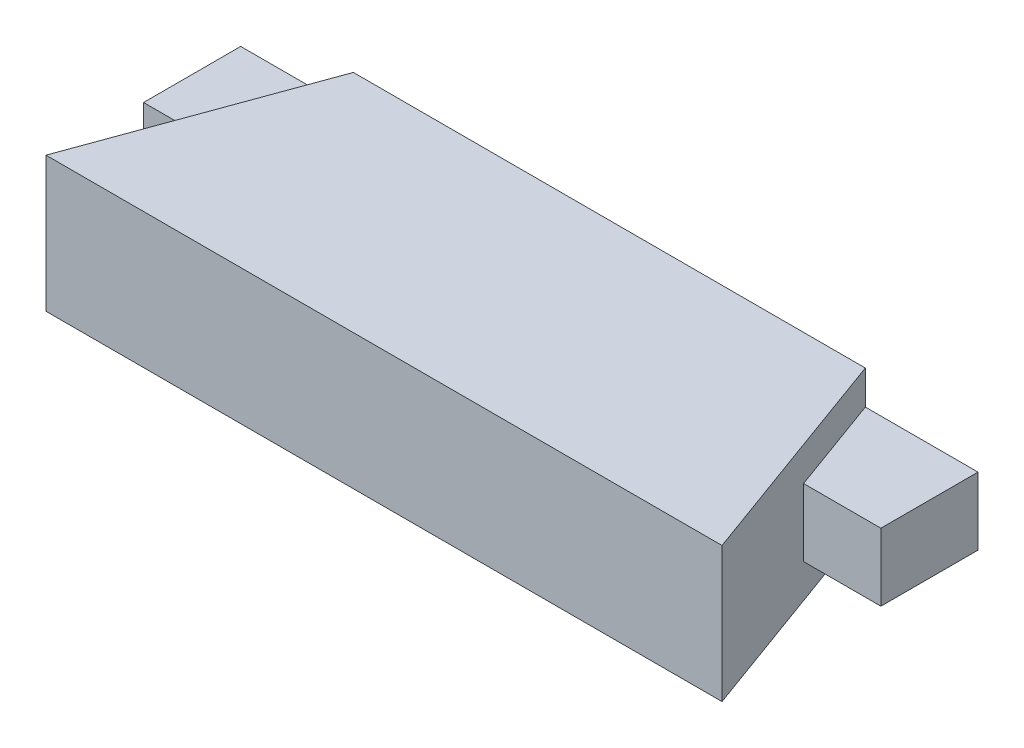
ISO-10303-21;
HEADER;
FILE_DESCRIPTION(('STEP AP214'),'2;1');
FILE_NAME('part.step','',(''),(''),'','','');
FILE_SCHEMA(('AUTOMOTIVE_DESIGN { 1 0 10303 214 1 1 1 1 }'));
ENDSEC;
DATA;
#1=APPLICATION_CONTEXT('core data for automotive mechanical design processes');
#2=APPLICATION_PROTOCOL_DEFINITION('international standard','automotive_design',2000,#1);
#3=PRODUCT_CONTEXT('',#1,'mechanical');
#4=PRODUCT('Part','Part','',(#3));
#5=PRODUCT_RELATED_PRODUCT_CATEGORY('part','',(#4));
#6=PRODUCT_DEFINITION_FORMATION('','',#4);
#7=PRODUCT_DEFINITION_CONTEXT('part definition',#1,'design');
#8=PRODUCT_DEFINITION('design','',#6,#7);
#9=PRODUCT_DEFINITION_SHAPE('','',#8);
#10=(LENGTH_UNIT() NAMED_UNIT(*) SI_UNIT(.MILLI.,.METRE.));
#11=(NAMED_UNIT(*) PLANE_ANGLE_UNIT() SI_UNIT($,.RADIAN.));
#12=(NAMED_UNIT(*) SI_UNIT($,.STERADIAN.) SOLID_ANGLE_UNIT());
#13=UNCERTAINTY_MEASURE_WITH_UNIT(LENGTH_MEASURE(1.E-05),#10,'distance_accuracy_value','');
#14=(GEOMETRIC_REPRESENTATION_CONTEXT(3) GLOBAL_UNCERTAINTY_ASSIGNED_CONTEXT((#13)) GLOBAL_UNIT_ASSIGNED_CONTEXT((#10,
#11,#12)) REPRESENTATION_CONTEXT('',''));
#15=CARTESIAN_POINT('',(0.,0.,0.));
#16=DIRECTION('',(0.,0.,1.));
#17=DIRECTION('',(1.,0.,0.));
#18=AXIS2_PLACEMENT_3D('',#15,#16,#17);
#19=CARTESIAN_POINT('',(-75.,30.,0.));
#20=DIRECTION('',(0.93969262078591,0.,0.342020143325666));
#21=DIRECTION('',(0.342020143325666,0.,-0.93969262078591));
#22=AXIS2_PLACEMENT_3D('',#19,#20,#21);
#23=PLANE('',#22);
#24=DIRECTION('',(0.,-1.,0.));
#25=VECTOR('',#24,1.);
#26=CARTESIAN_POINT('',(-56.8014882866901,30.,-50.));
#27=LINE('',#26,#25);
#28=CARTESIAN_POINT('',(-56.8014882866901,30.,-50.));
#29=VERTEX_POINT('',#28);
#30=CARTESIAN_POINT('',(-56.8014882866901,22.5,-50.));
#31=VERTEX_POINT('',#30);
#32=EDGE_CURVE('E199',#29,#31,#27,.T.);
#33=ORIENTED_EDGE('',*,*,#32,.T.);
#34=DIRECTION('',(-0.342020143325666,0.,0.93969262078591));
#35=VECTOR('',#34,1.);
#36=CARTESIAN_POINT('',(-75.,22.5,0.));
#37=LINE('',#36,#35);
#38=CARTESIAN_POINT('',(-64.6450468351266,22.5,-28.45));
#39=VERTEX_POINT('',#38);
#40=EDGE_CURVE('E47',#31,#39,#37,.T.);
#41=ORIENTED_EDGE('',*,*,#40,.T.);
#42=DIRECTION('',(0.,1.,0.));
#43=VECTOR('',#42,1.);
#44=CARTESIAN_POINT('',(-64.6450468351266,30.,-28.45));
#45=LINE('',#44,#43);
#46=CARTESIAN_POINT('',(-64.6450468351266,7.49999999999997,-28.45));
#47=VERTEX_POINT('',#46);
#48=EDGE_CURVE('E51',#47,#39,#45,.T.);
#49=ORIENTED_EDGE('',*,*,#48,.F.);
#50=DIRECTION('',(0.342020143325666,0.,-0.93969262078591));
#51=VECTOR('',#50,1.);
#52=CARTESIAN_POINT('',(-75.,7.49999999999997,0.));
#53=LINE('',#52,#51);
#54=CARTESIAN_POINT('',(-56.8014882866901,7.49999999999997,-50.));
#55=VERTEX_POINT('',#54);
#56=EDGE_CURVE('E171',#47,#55,#53,.T.);
#57=ORIENTED_EDGE('',*,*,#56,.T.);
#58=CARTESIAN_POINT('',(-56.8014882866901,0.,-50.));
#59=VERTEX_POINT('',#58);
#60=EDGE_CURVE('E189',#55,#59,#27,.T.);
#61=ORIENTED_EDGE('',*,*,#60,.T.);
#62=DIRECTION('',(-0.342020143325666,0.,0.939692620785909));
#63=VECTOR('',#62,1.);
#64=CARTESIAN_POINT('',(-75.,0.,0.));
#65=LINE('',#64,#63);
#66=CARTESIAN_POINT('',(-75.,0.,0.));
#67=VERTEX_POINT('',#66);
#68=EDGE_CURVE('E178',#59,#67,#65,.T.);
#69=ORIENTED_EDGE('',*,*,#68,.T.);
#70=DIRECTION('',(0.,-1.,0.));
#71=VECTOR('',#70,1.);
#72=CARTESIAN_POINT('',(-75.,30.,0.));
#73=LINE('',#72,#71);
#74=CARTESIAN_POINT('',(-75.,30.,0.));
#75=VERTEX_POINT('',#74);
#76=EDGE_CURVE('E40',#75,#67,#73,.T.);
#77=ORIENTED_EDGE('',*,*,#76,.F.);
#78=DIRECTION('',(-0.342020143325666,0.,0.939692620785909));
#79=VECTOR('',#78,1.);
#80=CARTESIAN_POINT('',(-75.,30.,0.));
#81=LINE('',#80,#79);
#82=EDGE_CURVE('E179',#29,#75,#81,.T.);
#83=ORIENTED_EDGE('',*,*,#82,.F.);
#84=EDGE_LOOP('',(#33,#41,#49,#57,#61,#69,#77,#83));
#85=FACE_BOUND('',#84,.T.);
#86=ADVANCED_FACE('F33',(#85),#23,.F.);
#87=CARTESIAN_POINT('',(-75.,30.,0.));
#88=DIRECTION('',(0.,0.,-1.));
#89=DIRECTION('',(-1.,0.,0.));
#90=AXIS2_PLACEMENT_3D('',#87,#88,#89);
#91=PLANE('',#90);
#92=DIRECTION('',(1.,0.,0.));
#93=VECTOR('',#92,1.);
#94=CARTESIAN_POINT('',(-75.,0.,0.));
#95=LINE('',#94,#93);
#96=CARTESIAN_POINT('',(75.,0.,0.));
#97=VERTEX_POINT('',#96);
#98=EDGE_CURVE('E192',#67,#97,#95,.T.);
#99=ORIENTED_EDGE('',*,*,#98,.T.);
#100=DIRECTION('',(0.,-1.,0.));
#101=VECTOR('',#100,1.);
#102=CARTESIAN_POINT('',(75.,30.,0.));
#103=LINE('',#102,#101);
#104=CARTESIAN_POINT('',(75.,30.,0.));
#105=VERTEX_POINT('',#104);
#106=EDGE_CURVE('E205',#105,#97,#103,.T.);
#107=ORIENTED_EDGE('',*,*,#106,.F.);
#108=DIRECTION('',(1.,0.,0.));
#109=VECTOR('',#108,1.);
#110=CARTESIAN_POINT('',(-75.,30.,0.));
#111=LINE('',#110,#109);
#112=EDGE_CURVE('E182',#75,#105,#111,.T.);
#113=ORIENTED_EDGE('',*,*,#112,.F.);
#114=ORIENTED_EDGE('',*,*,#76,.T.);
#115=EDGE_LOOP('',(#99,#107,#113,#114));
#116=FACE_BOUND('',#115,.T.);
#117=ADVANCED_FACE('F210',(#116),#91,.F.);
#118=CARTESIAN_POINT('',(75.,30.,0.));
#119=DIRECTION('',(-0.939692620785907,0.,0.342020143325673));
#120=DIRECTION('',(0.342020143325673,0.,0.939692620785907));
#121=AXIS2_PLACEMENT_3D('',#118,#119,#120);
#122=PLANE('',#121);
#123=DIRECTION('',(0.,-1.,0.));
#124=VECTOR('',#123,1.);
#125=CARTESIAN_POINT('',(64.6450468351264,30.,-28.45));
#126=LINE('',#125,#124);
#127=CARTESIAN_POINT('',(64.6450468351264,22.5,-28.45));
#128=VERTEX_POINT('',#127);
#129=CARTESIAN_POINT('',(64.6450468351264,7.5,-28.45));
#130=VERTEX_POINT('',#129);
#131=EDGE_CURVE('E11',#128,#130,#126,.T.);
#132=ORIENTED_EDGE('',*,*,#131,.F.);
#133=DIRECTION('',(-0.342020143325673,0.,-0.939692620785907));
#134=VECTOR('',#133,1.);
#135=CARTESIAN_POINT('',(75.,22.5,0.));
#136=LINE('',#135,#134);
#137=CARTESIAN_POINT('',(56.8014882866896,22.5,-50.));
#138=VERTEX_POINT('',#137);
#139=EDGE_CURVE('E173',#128,#138,#136,.T.);
#140=ORIENTED_EDGE('',*,*,#139,.T.);
#141=DIRECTION('',(0.,-1.,0.));
#142=VECTOR('',#141,1.);
#143=CARTESIAN_POINT('',(56.8014882866896,30.,-50.));
#144=LINE('',#143,#142);
#145=CARTESIAN_POINT('',(56.8014882866896,30.,-50.));
#146=VERTEX_POINT('',#145);
#147=EDGE_CURVE('E202',#146,#138,#144,.T.);
#148=ORIENTED_EDGE('',*,*,#147,.F.);
#149=DIRECTION('',(-0.342020143325673,0.,-0.939692620785907));
#150=VECTOR('',#149,1.);
#151=CARTESIAN_POINT('',(75.,30.,0.));
#152=LINE('',#151,#150);
#153=EDGE_CURVE('E185',#105,#146,#152,.T.);
#154=ORIENTED_EDGE('',*,*,#153,.F.);
#155=ORIENTED_EDGE('',*,*,#106,.T.);
#156=DIRECTION('',(-0.342020143325673,0.,-0.939692620785907));
#157=VECTOR('',#156,1.);
#158=CARTESIAN_POINT('',(75.,0.,0.));
#159=LINE('',#158,#157);
#160=CARTESIAN_POINT('',(56.8014882866896,0.,-50.));
#161=VERTEX_POINT('',#160);
#162=EDGE_CURVE('E194',#97,#161,#159,.T.);
#163=ORIENTED_EDGE('',*,*,#162,.T.);
#164=CARTESIAN_POINT('',(56.8014882866896,7.49999999999998,-50.));
#165=VERTEX_POINT('',#164);
#166=EDGE_CURVE('E201',#165,#161,#144,.T.);
#167=ORIENTED_EDGE('',*,*,#166,.F.);
#168=DIRECTION('',(0.342020143325673,0.,0.939692620785907));
#169=VECTOR('',#168,1.);
#170=CARTESIAN_POINT('',(75.,7.5,0.));
#171=LINE('',#170,#169);
#172=EDGE_CURVE('E165',#165,#130,#171,.T.);
#173=ORIENTED_EDGE('',*,*,#172,.T.);
#174=EDGE_LOOP('',(#132,#140,#148,#154,#155,#163,#167,#173));
#175=FACE_BOUND('',#174,.T.);
#176=ADVANCED_FACE('F220',(#175),#122,.F.);
#177=CARTESIAN_POINT('',(-56.8014882866901,30.,-50.));
#178=DIRECTION('',(0.,0.,1.));
#179=DIRECTION('',(1.,0.,0.));
#180=AXIS2_PLACEMENT_3D('',#177,#178,#179);
#181=PLANE('',#180);
#182=ORIENTED_EDGE('',*,*,#60,.F.);
#183=DIRECTION('',(-1.,0.,0.));
#184=VECTOR('',#183,1.);
#185=CARTESIAN_POINT('',(81.8,7.5,-50.));
#186=LINE('',#185,#184);
#187=CARTESIAN_POINT('',(-81.8,7.49999999999997,-50.));
#188=VERTEX_POINT('',#187);
#189=EDGE_CURVE('E159',#55,#188,#186,.T.);
#190=ORIENTED_EDGE('',*,*,#189,.T.);
#191=DIRECTION('',(0.,1.,0.));
#192=VECTOR('',#191,1.);
#193=CARTESIAN_POINT('',(-81.8,22.5,-50.));
#194=LINE('',#193,#192);
#195=CARTESIAN_POINT('',(-81.8,22.5,-50.));
#196=VERTEX_POINT('',#195);
#197=EDGE_CURVE('E161',#188,#196,#194,.T.);
#198=ORIENTED_EDGE('',*,*,#197,.T.);
#199=DIRECTION('',(1.,0.,0.));
#200=VECTOR('',#199,1.);
#201=CARTESIAN_POINT('',(81.8,22.5,-50.));
#202=LINE('',#201,#200);
#203=EDGE_CURVE('E146',#196,#31,#202,.T.);
#204=ORIENTED_EDGE('',*,*,#203,.T.);
#205=ORIENTED_EDGE('',*,*,#32,.F.);
#206=DIRECTION('',(-1.,0.,0.));
#207=VECTOR('',#206,1.);
#208=CARTESIAN_POINT('',(-56.8014882866901,30.,-50.));
#209=LINE('',#208,#207);
#210=EDGE_CURVE('E187',#146,#29,#209,.T.);
#211=ORIENTED_EDGE('',*,*,#210,.F.);
#212=ORIENTED_EDGE('',*,*,#147,.T.);
#213=CARTESIAN_POINT('',(81.8,22.5,-50.));
#214=VERTEX_POINT('',#213);
#215=EDGE_CURVE('E149',#138,#214,#202,.T.);
#216=ORIENTED_EDGE('',*,*,#215,.T.);
#217=DIRECTION('',(0.,-1.,0.));
#218=VECTOR('',#217,1.);
#219=CARTESIAN_POINT('',(81.8,22.5,-50.));
#220=LINE('',#219,#218);
#221=CARTESIAN_POINT('',(81.8,7.5,-50.));
#222=VERTEX_POINT('',#221);
#223=EDGE_CURVE('E157',#214,#222,#220,.T.);
#224=ORIENTED_EDGE('',*,*,#223,.T.);
#225=EDGE_CURVE('E125',#222,#165,#186,.T.);
#226=ORIENTED_EDGE('',*,*,#225,.T.);
#227=ORIENTED_EDGE('',*,*,#166,.T.);
#228=DIRECTION('',(-1.,0.,0.));
#229=VECTOR('',#228,1.);
#230=CARTESIAN_POINT('',(-56.8014882866901,0.,-50.));
#231=LINE('',#230,#229);
#232=EDGE_CURVE('E183',#161,#59,#231,.T.);
#233=ORIENTED_EDGE('',*,*,#232,.T.);
#234=EDGE_LOOP('',(#182,#190,#198,#204,#205,#211,#212,#216,#224,#226,#227,#233));
#235=FACE_BOUND('',#234,.T.);
#236=ADVANCED_FACE('F232',(#235),#181,.F.);
#237=CARTESIAN_POINT('',(0.,30.,0.));
#238=DIRECTION('',(0.,-1.,0.));
#239=DIRECTION('',(0.,0.,-1.));
#240=AXIS2_PLACEMENT_3D('',#237,#238,#239);
#241=PLANE('',#240);
#242=ORIENTED_EDGE('',*,*,#82,.T.);
#243=ORIENTED_EDGE('',*,*,#112,.T.);
#244=ORIENTED_EDGE('',*,*,#153,.T.);
#245=ORIENTED_EDGE('',*,*,#210,.T.);
#246=EDGE_LOOP('',(#242,#243,#244,#245));
#247=FACE_BOUND('',#246,.T.);
#248=ADVANCED_FACE('F225',(#247),#241,.F.);
#249=CARTESIAN_POINT('',(0.,0.,0.));
#250=DIRECTION('',(0.,-1.,0.));
#251=DIRECTION('',(0.,0.,-1.));
#252=AXIS2_PLACEMENT_3D('',#249,#250,#251);
#253=PLANE('',#252);
#254=ORIENTED_EDGE('',*,*,#68,.F.);
#255=ORIENTED_EDGE('',*,*,#232,.F.);
#256=ORIENTED_EDGE('',*,*,#162,.F.);
#257=ORIENTED_EDGE('',*,*,#98,.F.);
#258=EDGE_LOOP('',(#254,#255,#256,#257));
#259=FACE_BOUND('',#258,.T.);
#260=ADVANCED_FACE('F216',(#259),#253,.T.);
#261=CARTESIAN_POINT('',(81.8,22.5,-28.45));
#262=DIRECTION('',(1.,0.,0.));
#263=DIRECTION('',(0.,0.,-1.));
#264=AXIS2_PLACEMENT_3D('',#261,#262,#263);
#265=PLANE('',#264);
#266=ORIENTED_EDGE('',*,*,#223,.F.);
#267=DIRECTION('',(0.,0.,-1.));
#268=VECTOR('',#267,1.);
#269=CARTESIAN_POINT('',(81.8,22.5,-28.45));
#270=LINE('',#269,#268);
#271=CARTESIAN_POINT('',(81.8,22.5,-28.45));
#272=VERTEX_POINT('',#271);
#273=EDGE_CURVE('E145',#272,#214,#270,.T.);
#274=ORIENTED_EDGE('',*,*,#273,.F.);
#275=DIRECTION('',(0.,-1.,0.));
#276=VECTOR('',#275,1.);
#277=CARTESIAN_POINT('',(81.8,22.5,-28.45));
#278=LINE('',#277,#276);
#279=CARTESIAN_POINT('',(81.8,7.5,-28.45));
#280=VERTEX_POINT('',#279);
#281=EDGE_CURVE('E137',#272,#280,#278,.T.);
#282=ORIENTED_EDGE('',*,*,#281,.T.);
#283=DIRECTION('',(0.,0.,-1.));
#284=VECTOR('',#283,1.);
#285=CARTESIAN_POINT('',(81.8,7.5,-28.45));
#286=LINE('',#285,#284);
#287=EDGE_CURVE('E119',#280,#222,#286,.T.);
#288=ORIENTED_EDGE('',*,*,#287,.T.);
#289=EDGE_LOOP('',(#266,#274,#282,#288));
#290=FACE_BOUND('',#289,.T.);
#291=ADVANCED_FACE('F143',(#290),#265,.T.);
#292=CARTESIAN_POINT('',(0.,0.,-28.45));
#293=DIRECTION('',(0.,0.,-1.));
#294=DIRECTION('',(-1.,0.,0.));
#295=AXIS2_PLACEMENT_3D('',#292,#293,#294);
#296=PLANE('',#295);
#297=DIRECTION('',(1.,0.,0.));
#298=VECTOR('',#297,1.);
#299=CARTESIAN_POINT('',(81.8,22.5,-28.45));
#300=LINE('',#299,#298);
#301=EDGE_CURVE('E154',#128,#272,#300,.T.);
#302=ORIENTED_EDGE('',*,*,#301,.F.);
#303=ORIENTED_EDGE('',*,*,#131,.T.);
#304=DIRECTION('',(-1.,0.,0.));
#305=VECTOR('',#304,1.);
#306=CARTESIAN_POINT('',(81.8,7.5,-28.45));
#307=LINE('',#306,#305);
#308=EDGE_CURVE('E123',#280,#130,#307,.T.);
#309=ORIENTED_EDGE('',*,*,#308,.F.);
#310=ORIENTED_EDGE('',*,*,#281,.F.);
#311=EDGE_LOOP('',(#302,#303,#309,#310));
#312=FACE_BOUND('',#311,.T.);
#313=ADVANCED_FACE('F136',(#312),#296,.F.);
#314=CARTESIAN_POINT('',(81.8,7.5,-28.45));
#315=DIRECTION('',(0.,-1.,0.));
#316=DIRECTION('',(1.,0.,0.));
#317=AXIS2_PLACEMENT_3D('',#314,#315,#316);
#318=PLANE('',#317);
#319=ORIENTED_EDGE('',*,*,#172,.F.);
#320=ORIENTED_EDGE('',*,*,#225,.F.);
#321=ORIENTED_EDGE('',*,*,#287,.F.);
#322=ORIENTED_EDGE('',*,*,#308,.T.);
#323=EDGE_LOOP('',(#319,#320,#321,#322));
#324=FACE_BOUND('',#323,.T.);
#325=ADVANCED_FACE('F122',(#324),#318,.T.);
#326=CARTESIAN_POINT('',(81.8,22.5,-28.45));
#327=DIRECTION('',(0.,1.,0.));
#328=DIRECTION('',(-1.,0.,0.));
#329=AXIS2_PLACEMENT_3D('',#326,#327,#328);
#330=PLANE('',#329);
#331=ORIENTED_EDGE('',*,*,#139,.F.);
#332=ORIENTED_EDGE('',*,*,#301,.T.);
#333=ORIENTED_EDGE('',*,*,#273,.T.);
#334=ORIENTED_EDGE('',*,*,#215,.F.);
#335=EDGE_LOOP('',(#331,#332,#333,#334));
#336=FACE_BOUND('',#335,.T.);
#337=ADVANCED_FACE('F252',(#336),#330,.T.);
#338=CARTESIAN_POINT('',(-81.8,7.49999999999997,-28.45));
#339=VERTEX_POINT('',#338);
#340=EDGE_CURVE('E140',#47,#339,#307,.T.);
#341=ORIENTED_EDGE('',*,*,#340,.F.);
#342=ORIENTED_EDGE('',*,*,#48,.T.);
#343=CARTESIAN_POINT('',(-81.8,22.5,-28.45));
#344=VERTEX_POINT('',#343);
#345=EDGE_CURVE('E131',#344,#39,#300,.T.);
#346=ORIENTED_EDGE('',*,*,#345,.F.);
#347=DIRECTION('',(0.,1.,0.));
#348=VECTOR('',#347,1.);
#349=CARTESIAN_POINT('',(-81.8,22.5,-28.45));
#350=LINE('',#349,#348);
#351=EDGE_CURVE('E139',#339,#344,#350,.T.);
#352=ORIENTED_EDGE('',*,*,#351,.F.);
#353=EDGE_LOOP('',(#341,#342,#346,#352));
#354=FACE_BOUND('',#353,.T.);
#355=ADVANCED_FACE('F241',(#354),#296,.F.);
#356=ORIENTED_EDGE('',*,*,#40,.F.);
#357=ORIENTED_EDGE('',*,*,#203,.F.);
#358=DIRECTION('',(0.,0.,-1.));
#359=VECTOR('',#358,1.);
#360=CARTESIAN_POINT('',(-81.8,22.5,-28.45));
#361=LINE('',#360,#359);
#362=EDGE_CURVE('E166',#344,#196,#361,.T.);
#363=ORIENTED_EDGE('',*,*,#362,.F.);
#364=ORIENTED_EDGE('',*,*,#345,.T.);
#365=EDGE_LOOP('',(#356,#357,#363,#364));
#366=FACE_BOUND('',#365,.T.);
#367=ADVANCED_FACE('F230',(#366),#330,.T.);
#368=ORIENTED_EDGE('',*,*,#56,.F.);
#369=ORIENTED_EDGE('',*,*,#340,.T.);
#370=DIRECTION('',(0.,0.,-1.));
#371=VECTOR('',#370,1.);
#372=CARTESIAN_POINT('',(-81.8,7.49999999999997,-28.45));
#373=LINE('',#372,#371);
#374=EDGE_CURVE('E130',#339,#188,#373,.T.);
#375=ORIENTED_EDGE('',*,*,#374,.T.);
#376=ORIENTED_EDGE('',*,*,#189,.F.);
#377=EDGE_LOOP('',(#368,#369,#375,#376));
#378=FACE_BOUND('',#377,.T.);
#379=ADVANCED_FACE('F243',(#378),#318,.T.);
#380=CARTESIAN_POINT('',(-81.8,22.5,-28.45));
#381=DIRECTION('',(-1.,0.,0.));
#382=DIRECTION('',(0.,0.,1.));
#383=AXIS2_PLACEMENT_3D('',#380,#381,#382);
#384=PLANE('',#383);
#385=ORIENTED_EDGE('',*,*,#197,.F.);
#386=ORIENTED_EDGE('',*,*,#374,.F.);
#387=ORIENTED_EDGE('',*,*,#351,.T.);
#388=ORIENTED_EDGE('',*,*,#362,.T.);
#389=EDGE_LOOP('',(#385,#386,#387,#388));
#390=FACE_BOUND('',#389,.T.);
#391=ADVANCED_FACE('F237',(#390),#384,.T.);
#392=CLOSED_SHELL('',(#86,#117,#176,#236,#248,#260,#291,#313,#325,#337,#355,#367,#379,#391));
#393=MANIFOLD_SOLID_BREP('B2',#392);
#394=ADVANCED_BREP_SHAPE_REPRESENTATION('',(#18,#393),#14);
#395=SHAPE_DEFINITION_REPRESENTATION(#9,#394);
ENDSEC;
END-ISO-10303-21;
